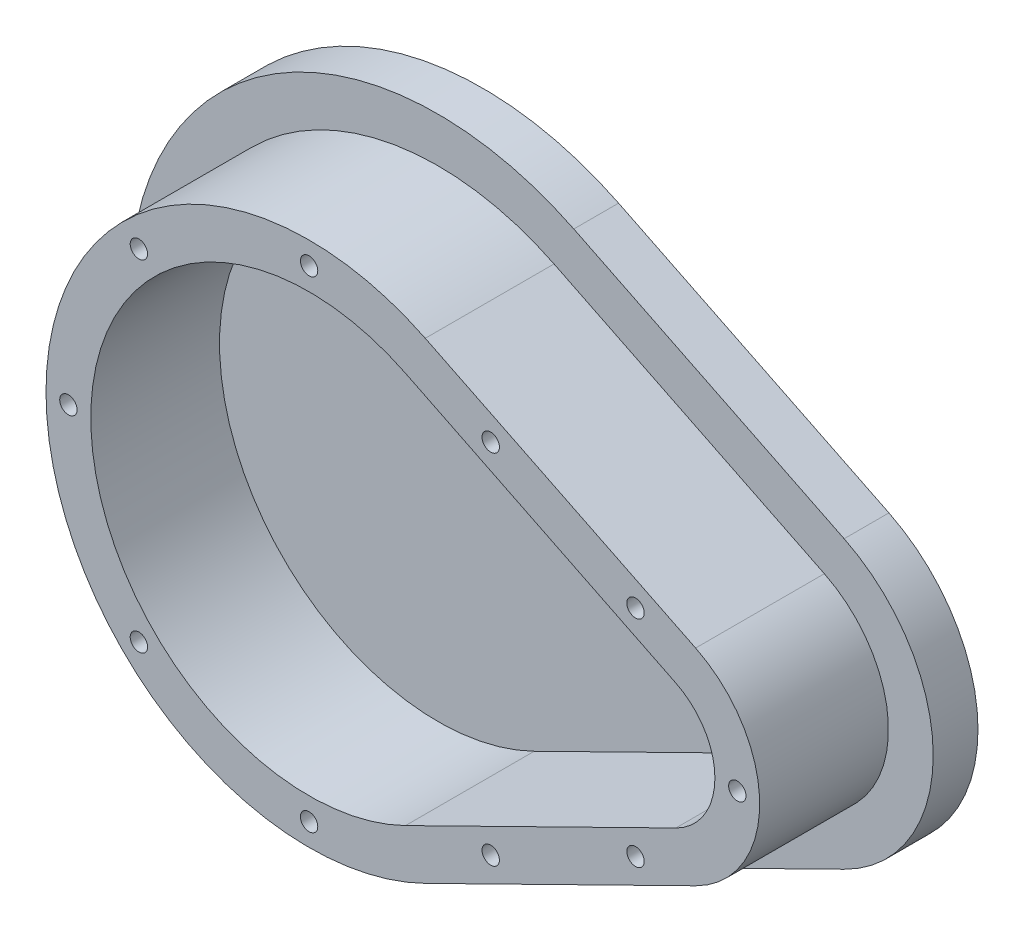
ISO-10303-21;
HEADER;
FILE_DESCRIPTION(('STEP AP214'),'2;1');
FILE_NAME('part.step','',(''),(''),'','','');
FILE_SCHEMA(('AUTOMOTIVE_DESIGN { 1 0 10303 214 1 1 1 1 }'));
ENDSEC;
DATA;
#1=APPLICATION_CONTEXT('core data for automotive mechanical design processes');
#2=APPLICATION_PROTOCOL_DEFINITION('international standard','automotive_design',2000,#1);
#3=PRODUCT_CONTEXT('',#1,'mechanical');
#4=PRODUCT('Part','Part','',(#3));
#5=PRODUCT_RELATED_PRODUCT_CATEGORY('part','',(#4));
#6=PRODUCT_DEFINITION_FORMATION('','',#4);
#7=PRODUCT_DEFINITION_CONTEXT('part definition',#1,'design');
#8=PRODUCT_DEFINITION('design','',#6,#7);
#9=PRODUCT_DEFINITION_SHAPE('','',#8);
#10=(LENGTH_UNIT() NAMED_UNIT(*) SI_UNIT(.MILLI.,.METRE.));
#11=(NAMED_UNIT(*) PLANE_ANGLE_UNIT() SI_UNIT($,.RADIAN.));
#12=(NAMED_UNIT(*) SI_UNIT($,.STERADIAN.) SOLID_ANGLE_UNIT());
#13=UNCERTAINTY_MEASURE_WITH_UNIT(LENGTH_MEASURE(1.E-05),#10,'distance_accuracy_value','');
#14=(GEOMETRIC_REPRESENTATION_CONTEXT(3) GLOBAL_UNCERTAINTY_ASSIGNED_CONTEXT((#13)) GLOBAL_UNIT_ASSIGNED_CONTEXT((#10,
#11,#12)) REPRESENTATION_CONTEXT('',''));
#15=CARTESIAN_POINT('',(0.,0.,0.));
#16=DIRECTION('',(0.,0.,1.));
#17=DIRECTION('',(1.,0.,0.));
#18=AXIS2_PLACEMENT_3D('',#15,#16,#17);
#19=CARTESIAN_POINT('',(60.,0.,8.));
#20=DIRECTION('',(0.,0.,-1.));
#21=DIRECTION('',(-1.,0.,0.));
#22=AXIS2_PLACEMENT_3D('',#19,#20,#21);
#23=PLANE('',#22);
#24=CARTESIAN_POINT('',(60.,0.,8.));
#25=DIRECTION('',(0.,0.,1.));
#26=DIRECTION('',(-1.,0.,0.));
#27=AXIS2_PLACEMENT_3D('',#24,#25,#26);
#28=CIRCLE('',#27,28.5);
#29=CARTESIAN_POINT('',(72.5875,-25.5696078137698,8.));
#30=VERTEX_POINT('',#29);
#31=CARTESIAN_POINT('',(72.5875,25.5696078137698,8.));
#32=VERTEX_POINT('',#31);
#33=EDGE_CURVE('E224',#30,#32,#28,.T.);
#34=ORIENTED_EDGE('',*,*,#33,.T.);
#35=DIRECTION('',(-0.897179221535784,0.441666666666667,0.));
#36=VECTOR('',#35,1.);
#37=CARTESIAN_POINT('',(72.5875,25.5696078137698,8.));
#38=LINE('',#37,#36);
#39=CARTESIAN_POINT('',(24.2916666666667,49.3448571844681,8.));
#40=VERTEX_POINT('',#39);
#41=EDGE_CURVE('E228',#32,#40,#38,.T.);
#42=ORIENTED_EDGE('',*,*,#41,.T.);
#43=CARTESIAN_POINT('',(0.,0.,8.));
#44=DIRECTION('',(0.,0.,1.));
#45=DIRECTION('',(1.,0.,0.));
#46=AXIS2_PLACEMENT_3D('',#43,#44,#45);
#47=CIRCLE('',#46,55.);
#48=CARTESIAN_POINT('',(24.2916666666667,-49.3448571844681,8.));
#49=VERTEX_POINT('',#48);
#50=EDGE_CURVE('E232',#40,#49,#47,.T.);
#51=ORIENTED_EDGE('',*,*,#50,.T.);
#52=DIRECTION('',(0.897179221535784,0.441666666666667,0.));
#53=VECTOR('',#52,1.);
#54=CARTESIAN_POINT('',(72.5875,-25.5696078137698,8.));
#55=LINE('',#54,#53);
#56=EDGE_CURVE('E235',#49,#30,#55,.T.);
#57=ORIENTED_EDGE('',*,*,#56,.T.);
#58=EDGE_LOOP('',(#34,#42,#51,#57));
#59=FACE_BOUND('',#58,.T.);
#60=CARTESIAN_POINT('',(0.,0.,8.));
#61=DIRECTION('',(0.,0.,1.));
#62=DIRECTION('',(1.,0.,0.));
#63=AXIS2_PLACEMENT_3D('',#60,#61,#62);
#64=CIRCLE('',#63,47.);
#65=CARTESIAN_POINT('',(20.7583333333334,42.1674234121819,8.));
#66=VERTEX_POINT('',#65);
#67=CARTESIAN_POINT('',(20.7583333333333,-42.1674234121819,8.));
#68=VERTEX_POINT('',#67);
#69=EDGE_CURVE('E148',#66,#68,#64,.T.);
#70=ORIENTED_EDGE('',*,*,#69,.F.);
#71=DIRECTION('',(-0.897179221535784,0.441666666666667,0.));
#72=VECTOR('',#71,1.);
#73=CARTESIAN_POINT('',(20.7583333333334,42.1674234121819,8.));
#74=LINE('',#73,#72);
#75=CARTESIAN_POINT('',(69.0541666666667,18.3921740414836,8.));
#76=VERTEX_POINT('',#75);
#77=EDGE_CURVE('E189',#76,#66,#74,.T.);
#78=ORIENTED_EDGE('',*,*,#77,.F.);
#79=CARTESIAN_POINT('',(60.,0.,8.));
#80=DIRECTION('',(0.,0.,1.));
#81=DIRECTION('',(-1.,0.,0.));
#82=AXIS2_PLACEMENT_3D('',#79,#80,#81);
#83=CIRCLE('',#82,20.5);
#84=CARTESIAN_POINT('',(69.0541666666667,-18.3921740414836,8.));
#85=VERTEX_POINT('',#84);
#86=EDGE_CURVE('E60',#85,#76,#83,.T.);
#87=ORIENTED_EDGE('',*,*,#86,.F.);
#88=DIRECTION('',(0.897179221535784,0.441666666666667,0.));
#89=VECTOR('',#88,1.);
#90=CARTESIAN_POINT('',(69.0541666666667,-18.3921740414836,8.));
#91=LINE('',#90,#89);
#92=EDGE_CURVE('E55',#68,#85,#91,.T.);
#93=ORIENTED_EDGE('',*,*,#92,.F.);
#94=EDGE_LOOP('',(#70,#78,#87,#93));
#95=FACE_BOUND('',#94,.T.);
#96=ADVANCED_FACE('F39',(#59,#95),#23,.F.);
#97=CARTESIAN_POINT('',(60.,0.,8.));
#98=DIRECTION('',(0.,0.,-1.));
#99=DIRECTION('',(-1.,0.,0.));
#100=AXIS2_PLACEMENT_3D('',#97,#98,#99);
#101=CYLINDRICAL_SURFACE('',#100,28.5);
#102=CARTESIAN_POINT('',(60.,0.,0.));
#103=DIRECTION('',(0.,0.,1.));
#104=DIRECTION('',(-1.,0.,0.));
#105=AXIS2_PLACEMENT_3D('',#102,#103,#104);
#106=CIRCLE('',#105,28.5);
#107=CARTESIAN_POINT('',(72.5875,-25.5696078137698,0.));
#108=VERTEX_POINT('',#107);
#109=CARTESIAN_POINT('',(72.5875,25.5696078137698,0.));
#110=VERTEX_POINT('',#109);
#111=EDGE_CURVE('E223',#108,#110,#106,.T.);
#112=ORIENTED_EDGE('',*,*,#111,.T.);
#113=DIRECTION('',(0.,0.,-1.));
#114=VECTOR('',#113,1.);
#115=CARTESIAN_POINT('',(72.5875,25.5696078137698,8.));
#116=LINE('',#115,#114);
#117=EDGE_CURVE('E11',#32,#110,#116,.T.);
#118=ORIENTED_EDGE('',*,*,#117,.F.);
#119=ORIENTED_EDGE('',*,*,#33,.F.);
#120=DIRECTION('',(0.,0.,-1.));
#121=VECTOR('',#120,1.);
#122=CARTESIAN_POINT('',(72.5875,-25.5696078137698,8.));
#123=LINE('',#122,#121);
#124=EDGE_CURVE('E238',#30,#108,#123,.T.);
#125=ORIENTED_EDGE('',*,*,#124,.T.);
#126=EDGE_LOOP('',(#112,#118,#119,#125));
#127=FACE_BOUND('',#126,.T.);
#128=ADVANCED_FACE('F41',(#127),#101,.T.);
#129=CARTESIAN_POINT('',(72.5875,25.5696078137698,8.));
#130=DIRECTION('',(-0.441666666666667,-0.897179221535784,0.));
#131=DIRECTION('',(0.897179221535784,-0.441666666666667,0.));
#132=AXIS2_PLACEMENT_3D('',#129,#130,#131);
#133=PLANE('',#132);
#134=DIRECTION('',(-0.897179221535784,0.441666666666667,0.));
#135=VECTOR('',#134,1.);
#136=CARTESIAN_POINT('',(72.5875,25.5696078137698,0.));
#137=LINE('',#136,#135);
#138=CARTESIAN_POINT('',(24.2916666666667,49.3448571844681,0.));
#139=VERTEX_POINT('',#138);
#140=EDGE_CURVE('E242',#110,#139,#137,.T.);
#141=ORIENTED_EDGE('',*,*,#140,.T.);
#142=DIRECTION('',(0.,0.,-1.));
#143=VECTOR('',#142,1.);
#144=CARTESIAN_POINT('',(24.2916666666667,49.3448571844681,8.));
#145=LINE('',#144,#143);
#146=EDGE_CURVE('E48',#40,#139,#145,.T.);
#147=ORIENTED_EDGE('',*,*,#146,.F.);
#148=ORIENTED_EDGE('',*,*,#41,.F.);
#149=ORIENTED_EDGE('',*,*,#117,.T.);
#150=EDGE_LOOP('',(#141,#147,#148,#149));
#151=FACE_BOUND('',#150,.T.);
#152=ADVANCED_FACE('F277',(#151),#133,.F.);
#153=CARTESIAN_POINT('',(0.,0.,8.));
#154=DIRECTION('',(0.,0.,-1.));
#155=DIRECTION('',(-1.,0.,0.));
#156=AXIS2_PLACEMENT_3D('',#153,#154,#155);
#157=CYLINDRICAL_SURFACE('',#156,55.);
#158=CARTESIAN_POINT('',(0.,0.,0.));
#159=DIRECTION('',(0.,0.,1.));
#160=DIRECTION('',(1.,0.,0.));
#161=AXIS2_PLACEMENT_3D('',#158,#159,#160);
#162=CIRCLE('',#161,55.);
#163=CARTESIAN_POINT('',(24.2916666666667,-49.3448571844681,0.));
#164=VERTEX_POINT('',#163);
#165=EDGE_CURVE('E245',#139,#164,#162,.T.);
#166=ORIENTED_EDGE('',*,*,#165,.T.);
#167=DIRECTION('',(0.,0.,-1.));
#168=VECTOR('',#167,1.);
#169=CARTESIAN_POINT('',(24.2916666666667,-49.3448571844681,8.));
#170=LINE('',#169,#168);
#171=EDGE_CURVE('E253',#49,#164,#170,.T.);
#172=ORIENTED_EDGE('',*,*,#171,.F.);
#173=ORIENTED_EDGE('',*,*,#50,.F.);
#174=ORIENTED_EDGE('',*,*,#146,.T.);
#175=EDGE_LOOP('',(#166,#172,#173,#174));
#176=FACE_BOUND('',#175,.T.);
#177=ADVANCED_FACE('F262',(#176),#157,.T.);
#178=CARTESIAN_POINT('',(72.5875,-25.5696078137698,8.));
#179=DIRECTION('',(-0.441666666666667,0.897179221535784,0.));
#180=DIRECTION('',(-0.897179221535784,-0.441666666666667,0.));
#181=AXIS2_PLACEMENT_3D('',#178,#179,#180);
#182=PLANE('',#181);
#183=DIRECTION('',(0.897179221535784,0.441666666666667,0.));
#184=VECTOR('',#183,1.);
#185=CARTESIAN_POINT('',(72.5875,-25.5696078137698,0.));
#186=LINE('',#185,#184);
#187=EDGE_CURVE('E229',#164,#108,#186,.T.);
#188=ORIENTED_EDGE('',*,*,#187,.T.);
#189=ORIENTED_EDGE('',*,*,#124,.F.);
#190=ORIENTED_EDGE('',*,*,#56,.F.);
#191=ORIENTED_EDGE('',*,*,#171,.T.);
#192=EDGE_LOOP('',(#188,#189,#190,#191));
#193=FACE_BOUND('',#192,.T.);
#194=ADVANCED_FACE('F271',(#193),#182,.F.);
#195=CARTESIAN_POINT('',(60.,0.,0.));
#196=DIRECTION('',(0.,0.,-1.));
#197=DIRECTION('',(-1.,0.,0.));
#198=AXIS2_PLACEMENT_3D('',#195,#196,#197);
#199=PLANE('',#198);
#200=CARTESIAN_POINT('',(0.,43.,0.));
#201=DIRECTION('',(0.,0.,-1.));
#202=DIRECTION('',(-1.,0.,0.));
#203=AXIS2_PLACEMENT_3D('',#200,#201,#202);
#204=CIRCLE('',#203,1.55);
#205=CARTESIAN_POINT('',(-1.55,43.,0.));
#206=VERTEX_POINT('',#205);
#207=EDGE_CURVE('E167',#206,#206,#204,.F.);
#208=ORIENTED_EDGE('',*,*,#207,.T.);
#209=EDGE_LOOP('',(#208));
#210=FACE_BOUND('',#209,.T.);
#211=CARTESIAN_POINT('',(32.4493549897034,-31.9537065260387,0.));
#212=DIRECTION('',(0.,0.,-1.));
#213=DIRECTION('',(-1.,0.,0.));
#214=AXIS2_PLACEMENT_3D('',#211,#212,#213);
#215=CIRCLE('',#214,1.55);
#216=CARTESIAN_POINT('',(30.8993549897034,-31.9537065260387,0.));
#217=VERTEX_POINT('',#216);
#218=EDGE_CURVE('E510',#217,#217,#215,.F.);
#219=ORIENTED_EDGE('',*,*,#218,.T.);
#220=EDGE_LOOP('',(#219));
#221=FACE_BOUND('',#220,.T.);
#222=CARTESIAN_POINT('',(-30.4055915910181,-30.405591591022,0.));
#223=DIRECTION('',(0.,0.,-1.));
#224=DIRECTION('',(-1.,0.,0.));
#225=AXIS2_PLACEMENT_3D('',#222,#223,#224);
#226=CIRCLE('',#225,1.55000000000305);
#227=CARTESIAN_POINT('',(-31.9555915910211,-30.405591591022,0.));
#228=VERTEX_POINT('',#227);
#229=EDGE_CURVE('E552',#228,#228,#226,.F.);
#230=ORIENTED_EDGE('',*,*,#229,.T.);
#231=EDGE_LOOP('',(#230));
#232=FACE_BOUND('',#231,.T.);
#233=CARTESIAN_POINT('',(-42.999999999997,-1.42165573929378E-12,0.));
#234=DIRECTION('',(0.,0.,-1.));
#235=DIRECTION('',(-1.,0.,0.));
#236=AXIS2_PLACEMENT_3D('',#233,#234,#235);
#237=CIRCLE('',#236,1.55000000000211);
#238=CARTESIAN_POINT('',(-44.5499999999991,-1.42165573929378E-12,0.));
#239=VERTEX_POINT('',#238);
#240=EDGE_CURVE('E551',#239,#239,#237,.F.);
#241=ORIENTED_EDGE('',*,*,#240,.T.);
#242=EDGE_LOOP('',(#241));
#243=FACE_BOUND('',#242,.T.);
#244=CARTESIAN_POINT('',(-30.4055915910201,30.40559159102,0.));
#245=DIRECTION('',(0.,0.,-1.));
#246=DIRECTION('',(-1.,0.,0.));
#247=AXIS2_PLACEMENT_3D('',#244,#245,#246);
#248=CIRCLE('',#247,1.55000000000064);
#249=CARTESIAN_POINT('',(-31.9555915910207,30.40559159102,0.));
#250=VERTEX_POINT('',#249);
#251=EDGE_CURVE('E567',#250,#250,#248,.F.);
#252=ORIENTED_EDGE('',*,*,#251,.T.);
#253=EDGE_LOOP('',(#252));
#254=FACE_BOUND('',#253,.T.);
#255=CARTESIAN_POINT('',(76.5,0.,0.));
#256=DIRECTION('',(0.,0.,-1.));
#257=DIRECTION('',(-1.,0.,0.));
#258=AXIS2_PLACEMENT_3D('',#255,#256,#257);
#259=CIRCLE('',#258,1.54999999999999);
#260=CARTESIAN_POINT('',(74.95,0.,0.));
#261=VERTEX_POINT('',#260);
#262=EDGE_CURVE('E503',#261,#261,#259,.F.);
#263=ORIENTED_EDGE('',*,*,#262,.T.);
#264=EDGE_LOOP('',(#263));
#265=FACE_BOUND('',#264,.T.);
#266=CARTESIAN_POINT('',(58.3157077846422,-19.2201238220071,0.));
#267=DIRECTION('',(0.,0.,-1.));
#268=DIRECTION('',(-1.,0.,0.));
#269=AXIS2_PLACEMENT_3D('',#266,#267,#268);
#270=CIRCLE('',#269,1.55);
#271=CARTESIAN_POINT('',(56.7657077846422,-19.2201238220071,0.));
#272=VERTEX_POINT('',#271);
#273=EDGE_CURVE('E520',#272,#272,#270,.F.);
#274=ORIENTED_EDGE('',*,*,#273,.T.);
#275=EDGE_LOOP('',(#274));
#276=FACE_BOUND('',#275,.T.);
#277=CARTESIAN_POINT('',(32.4493549897034,31.9537065260387,0.));
#278=DIRECTION('',(0.,0.,-1.));
#279=DIRECTION('',(-1.,0.,0.));
#280=AXIS2_PLACEMENT_3D('',#277,#278,#279);
#281=CIRCLE('',#280,1.55);
#282=CARTESIAN_POINT('',(30.8993549897034,31.9537065260387,0.));
#283=VERTEX_POINT('',#282);
#284=EDGE_CURVE('E519',#283,#283,#281,.F.);
#285=ORIENTED_EDGE('',*,*,#284,.T.);
#286=EDGE_LOOP('',(#285));
#287=FACE_BOUND('',#286,.T.);
#288=CARTESIAN_POINT('',(58.3157077846422,19.2201238220071,0.));
#289=DIRECTION('',(0.,0.,-1.));
#290=DIRECTION('',(-1.,0.,0.));
#291=AXIS2_PLACEMENT_3D('',#288,#289,#290);
#292=CIRCLE('',#291,1.55);
#293=CARTESIAN_POINT('',(56.7657077846421,19.2201238220071,0.));
#294=VERTEX_POINT('',#293);
#295=EDGE_CURVE('E536',#294,#294,#292,.F.);
#296=ORIENTED_EDGE('',*,*,#295,.T.);
#297=EDGE_LOOP('',(#296));
#298=FACE_BOUND('',#297,.T.);
#299=CARTESIAN_POINT('',(2.84331147858757E-12,-43.,0.));
#300=DIRECTION('',(0.,0.,-1.));
#301=DIRECTION('',(-1.,0.,0.));
#302=AXIS2_PLACEMENT_3D('',#299,#300,#301);
#303=CIRCLE('',#302,1.55000000000243);
#304=CARTESIAN_POINT('',(-1.54999999999959,-43.,0.));
#305=VERTEX_POINT('',#304);
#306=EDGE_CURVE('E535',#305,#305,#303,.F.);
#307=ORIENTED_EDGE('',*,*,#306,.T.);
#308=EDGE_LOOP('',(#307));
#309=FACE_BOUND('',#308,.T.);
#310=ORIENTED_EDGE('',*,*,#111,.F.);
#311=ORIENTED_EDGE('',*,*,#187,.F.);
#312=ORIENTED_EDGE('',*,*,#165,.F.);
#313=ORIENTED_EDGE('',*,*,#140,.F.);
#314=EDGE_LOOP('',(#310,#311,#312,#313));
#315=FACE_BOUND('',#314,.T.);
#316=ADVANCED_FACE('F268',(#210,#221,#232,#243,#254,#265,#276,#287,#298,#309,#315),#199,.T.);
#317=CARTESIAN_POINT('',(0.,0.,31.));
#318=DIRECTION('',(0.,0.,1.));
#319=DIRECTION('',(1.,0.,0.));
#320=AXIS2_PLACEMENT_3D('',#317,#318,#319);
#321=PLANE('',#320);
#322=CARTESIAN_POINT('',(0.,43.,31.));
#323=DIRECTION('',(0.,0.,1.));
#324=DIRECTION('',(1.,0.,0.));
#325=AXIS2_PLACEMENT_3D('',#322,#323,#324);
#326=CIRCLE('',#325,1.55);
#327=CARTESIAN_POINT('',(1.55,43.,31.));
#328=VERTEX_POINT('',#327);
#329=EDGE_CURVE('E497',#328,#328,#326,.T.);
#330=ORIENTED_EDGE('',*,*,#329,.F.);
#331=EDGE_LOOP('',(#330));
#332=FACE_BOUND('',#331,.T.);
#333=CARTESIAN_POINT('',(32.4493549897034,-31.9537065260387,31.));
#334=DIRECTION('',(0.,0.,1.));
#335=DIRECTION('',(1.,0.,0.));
#336=AXIS2_PLACEMENT_3D('',#333,#334,#335);
#337=CIRCLE('',#336,1.55);
#338=CARTESIAN_POINT('',(33.9993549897034,-31.9537065260387,31.));
#339=VERTEX_POINT('',#338);
#340=EDGE_CURVE('E506',#339,#339,#337,.T.);
#341=ORIENTED_EDGE('',*,*,#340,.F.);
#342=EDGE_LOOP('',(#341));
#343=FACE_BOUND('',#342,.T.);
#344=CARTESIAN_POINT('',(-30.4055915910181,-30.405591591022,31.));
#345=DIRECTION('',(0.,0.,1.));
#346=DIRECTION('',(1.,0.,0.));
#347=AXIS2_PLACEMENT_3D('',#344,#345,#346);
#348=CIRCLE('',#347,1.55000000000305);
#349=CARTESIAN_POINT('',(-28.855591591015,-30.405591591022,31.));
#350=VERTEX_POINT('',#349);
#351=EDGE_CURVE('E540',#350,#350,#348,.T.);
#352=ORIENTED_EDGE('',*,*,#351,.F.);
#353=EDGE_LOOP('',(#352));
#354=FACE_BOUND('',#353,.T.);
#355=CARTESIAN_POINT('',(-42.999999999997,-1.42165573929378E-12,31.));
#356=DIRECTION('',(0.,0.,1.));
#357=DIRECTION('',(1.,0.,0.));
#358=AXIS2_PLACEMENT_3D('',#355,#356,#357);
#359=CIRCLE('',#358,1.55000000000211);
#360=CARTESIAN_POINT('',(-41.4499999999948,-1.42165573929378E-12,31.));
#361=VERTEX_POINT('',#360);
#362=EDGE_CURVE('E547',#361,#361,#359,.T.);
#363=ORIENTED_EDGE('',*,*,#362,.F.);
#364=EDGE_LOOP('',(#363));
#365=FACE_BOUND('',#364,.T.);
#366=CARTESIAN_POINT('',(-30.4055915910201,30.40559159102,31.));
#367=DIRECTION('',(0.,0.,1.));
#368=DIRECTION('',(1.,0.,0.));
#369=AXIS2_PLACEMENT_3D('',#366,#367,#368);
#370=CIRCLE('',#369,1.55000000000064);
#371=CARTESIAN_POINT('',(-28.8555915910194,30.40559159102,31.));
#372=VERTEX_POINT('',#371);
#373=EDGE_CURVE('E556',#372,#372,#370,.T.);
#374=ORIENTED_EDGE('',*,*,#373,.F.);
#375=EDGE_LOOP('',(#374));
#376=FACE_BOUND('',#375,.T.);
#377=CARTESIAN_POINT('',(76.5,0.,31.));
#378=DIRECTION('',(0.,0.,1.));
#379=DIRECTION('',(1.,0.,0.));
#380=AXIS2_PLACEMENT_3D('',#377,#378,#379);
#381=CIRCLE('',#380,1.54999999999999);
#382=CARTESIAN_POINT('',(78.05,0.,31.));
#383=VERTEX_POINT('',#382);
#384=EDGE_CURVE('E563',#383,#383,#381,.T.);
#385=ORIENTED_EDGE('',*,*,#384,.F.);
#386=EDGE_LOOP('',(#385));
#387=FACE_BOUND('',#386,.T.);
#388=CARTESIAN_POINT('',(58.3157077846422,-19.2201238220071,31.));
#389=DIRECTION('',(0.,0.,1.));
#390=DIRECTION('',(1.,0.,0.));
#391=AXIS2_PLACEMENT_3D('',#388,#389,#390);
#392=CIRCLE('',#391,1.55);
#393=CARTESIAN_POINT('',(59.8657077846422,-19.2201238220071,31.));
#394=VERTEX_POINT('',#393);
#395=EDGE_CURVE('E514',#394,#394,#392,.T.);
#396=ORIENTED_EDGE('',*,*,#395,.F.);
#397=EDGE_LOOP('',(#396));
#398=FACE_BOUND('',#397,.T.);
#399=CARTESIAN_POINT('',(32.4493549897034,31.9537065260387,31.));
#400=DIRECTION('',(0.,0.,1.));
#401=DIRECTION('',(1.,0.,0.));
#402=AXIS2_PLACEMENT_3D('',#399,#400,#401);
#403=CIRCLE('',#402,1.55);
#404=CARTESIAN_POINT('',(33.9993549897034,31.9537065260387,31.));
#405=VERTEX_POINT('',#404);
#406=EDGE_CURVE('E515',#405,#405,#403,.T.);
#407=ORIENTED_EDGE('',*,*,#406,.F.);
#408=EDGE_LOOP('',(#407));
#409=FACE_BOUND('',#408,.T.);
#410=CARTESIAN_POINT('',(58.3157077846422,19.2201238220071,31.));
#411=DIRECTION('',(0.,0.,1.));
#412=DIRECTION('',(1.,0.,0.));
#413=AXIS2_PLACEMENT_3D('',#410,#411,#412);
#414=CIRCLE('',#413,1.55);
#415=CARTESIAN_POINT('',(59.8657077846422,19.2201238220071,31.));
#416=VERTEX_POINT('',#415);
#417=EDGE_CURVE('E524',#416,#416,#414,.T.);
#418=ORIENTED_EDGE('',*,*,#417,.F.);
#419=EDGE_LOOP('',(#418));
#420=FACE_BOUND('',#419,.T.);
#421=CARTESIAN_POINT('',(2.84331147858757E-12,-43.,31.));
#422=DIRECTION('',(0.,0.,1.));
#423=DIRECTION('',(1.,0.,0.));
#424=AXIS2_PLACEMENT_3D('',#421,#422,#423);
#425=CIRCLE('',#424,1.55000000000243);
#426=CARTESIAN_POINT('',(1.55000000000527,-43.,31.));
#427=VERTEX_POINT('',#426);
#428=EDGE_CURVE('E531',#427,#427,#425,.T.);
#429=ORIENTED_EDGE('',*,*,#428,.F.);
#430=EDGE_LOOP('',(#429));
#431=FACE_BOUND('',#430,.T.);
#432=CARTESIAN_POINT('',(0.,0.,31.));
#433=DIRECTION('',(0.,0.,1.));
#434=DIRECTION('',(1.,0.,0.));
#435=AXIS2_PLACEMENT_3D('',#432,#433,#434);
#436=CIRCLE('',#435,47.);
#437=CARTESIAN_POINT('',(20.7583333333334,42.1674234121819,31.));
#438=VERTEX_POINT('',#437);
#439=CARTESIAN_POINT('',(20.7583333333333,-42.1674234121819,31.));
#440=VERTEX_POINT('',#439);
#441=EDGE_CURVE('E184',#438,#440,#436,.T.);
#442=ORIENTED_EDGE('',*,*,#441,.T.);
#443=DIRECTION('',(0.897179221535784,0.441666666666667,0.));
#444=VECTOR('',#443,1.);
#445=CARTESIAN_POINT('',(69.0541666666667,-18.3921740414836,31.));
#446=LINE('',#445,#444);
#447=CARTESIAN_POINT('',(69.0541666666667,-18.3921740414836,31.));
#448=VERTEX_POINT('',#447);
#449=EDGE_CURVE('E188',#440,#448,#446,.T.);
#450=ORIENTED_EDGE('',*,*,#449,.T.);
#451=CARTESIAN_POINT('',(60.,0.,31.));
#452=DIRECTION('',(0.,0.,1.));
#453=DIRECTION('',(-1.,0.,0.));
#454=AXIS2_PLACEMENT_3D('',#451,#452,#453);
#455=CIRCLE('',#454,20.5);
#456=CARTESIAN_POINT('',(69.0541666666667,18.3921740414836,31.));
#457=VERTEX_POINT('',#456);
#458=EDGE_CURVE('E192',#448,#457,#455,.T.);
#459=ORIENTED_EDGE('',*,*,#458,.T.);
#460=DIRECTION('',(-0.897179221535784,0.441666666666667,0.));
#461=VECTOR('',#460,1.);
#462=CARTESIAN_POINT('',(20.7583333333334,42.1674234121819,31.));
#463=LINE('',#462,#461);
#464=EDGE_CURVE('E195',#457,#438,#463,.T.);
#465=ORIENTED_EDGE('',*,*,#464,.T.);
#466=EDGE_LOOP('',(#442,#450,#459,#465));
#467=FACE_BOUND('',#466,.T.);
#468=DIRECTION('',(-0.897179221535784,0.441666666666667,0.));
#469=VECTOR('',#468,1.);
#470=CARTESIAN_POINT('',(65.5208333333333,11.2147402691973,31.));
#471=LINE('',#470,#469);
#472=CARTESIAN_POINT('',(65.5208333333333,11.2147402691973,31.));
#473=VERTEX_POINT('',#472);
#474=CARTESIAN_POINT('',(17.225,34.9899896398956,31.));
#475=VERTEX_POINT('',#474);
#476=EDGE_CURVE('E139',#473,#475,#471,.T.);
#477=ORIENTED_EDGE('',*,*,#476,.F.);
#478=CARTESIAN_POINT('',(60.,0.,31.));
#479=DIRECTION('',(0.,0.,1.));
#480=DIRECTION('',(-1.,0.,0.));
#481=AXIS2_PLACEMENT_3D('',#478,#479,#480);
#482=CIRCLE('',#481,12.5);
#483=CARTESIAN_POINT('',(65.5208333333333,-11.2147402691973,31.));
#484=VERTEX_POINT('',#483);
#485=EDGE_CURVE('E128',#484,#473,#482,.T.);
#486=ORIENTED_EDGE('',*,*,#485,.F.);
#487=DIRECTION('',(0.897179221535784,0.441666666666667,0.));
#488=VECTOR('',#487,1.);
#489=CARTESIAN_POINT('',(65.5208333333333,-11.2147402691973,31.));
#490=LINE('',#489,#488);
#491=CARTESIAN_POINT('',(17.225,-34.9899896398956,31.));
#492=VERTEX_POINT('',#491);
#493=EDGE_CURVE('E158',#492,#484,#490,.T.);
#494=ORIENTED_EDGE('',*,*,#493,.F.);
#495=CARTESIAN_POINT('',(0.,0.,31.));
#496=DIRECTION('',(0.,0.,1.));
#497=DIRECTION('',(1.,0.,0.));
#498=AXIS2_PLACEMENT_3D('',#495,#496,#497);
#499=CIRCLE('',#498,39.);
#500=EDGE_CURVE('E154',#475,#492,#499,.T.);
#501=ORIENTED_EDGE('',*,*,#500,.F.);
#502=EDGE_LOOP('',(#477,#486,#494,#501));
#503=FACE_BOUND('',#502,.T.);
#504=ADVANCED_FACE('F152',(#332,#343,#354,#365,#376,#387,#398,#409,#420,#431,#467,#503),#321,.T.);
#505=CARTESIAN_POINT('',(0.,0.,31.));
#506=DIRECTION('',(0.,0.,-1.));
#507=DIRECTION('',(-1.,0.,0.));
#508=AXIS2_PLACEMENT_3D('',#505,#506,#507);
#509=CYLINDRICAL_SURFACE('',#508,47.);
#510=ORIENTED_EDGE('',*,*,#69,.T.);
#511=DIRECTION('',(0.,0.,-1.));
#512=VECTOR('',#511,1.);
#513=CARTESIAN_POINT('',(20.7583333333333,-42.1674234121819,31.));
#514=LINE('',#513,#512);
#515=EDGE_CURVE('E220',#440,#68,#514,.T.);
#516=ORIENTED_EDGE('',*,*,#515,.F.);
#517=ORIENTED_EDGE('',*,*,#441,.F.);
#518=DIRECTION('',(0.,0.,-1.));
#519=VECTOR('',#518,1.);
#520=CARTESIAN_POINT('',(20.7583333333334,42.1674234121819,31.));
#521=LINE('',#520,#519);
#522=EDGE_CURVE('E198',#438,#66,#521,.T.);
#523=ORIENTED_EDGE('',*,*,#522,.T.);
#524=EDGE_LOOP('',(#510,#516,#517,#523));
#525=FACE_BOUND('',#524,.T.);
#526=ADVANCED_FACE('F321',(#525),#509,.T.);
#527=CARTESIAN_POINT('',(69.0541666666667,-18.3921740414836,31.));
#528=DIRECTION('',(-0.441666666666667,0.897179221535784,0.));
#529=DIRECTION('',(-0.897179221535784,-0.441666666666667,0.));
#530=AXIS2_PLACEMENT_3D('',#527,#528,#529);
#531=PLANE('',#530);
#532=ORIENTED_EDGE('',*,*,#92,.T.);
#533=DIRECTION('',(0.,0.,-1.));
#534=VECTOR('',#533,1.);
#535=CARTESIAN_POINT('',(69.0541666666667,-18.3921740414836,31.));
#536=LINE('',#535,#534);
#537=EDGE_CURVE('E216',#448,#85,#536,.T.);
#538=ORIENTED_EDGE('',*,*,#537,.F.);
#539=ORIENTED_EDGE('',*,*,#449,.F.);
#540=ORIENTED_EDGE('',*,*,#515,.T.);
#541=EDGE_LOOP('',(#532,#538,#539,#540));
#542=FACE_BOUND('',#541,.T.);
#543=ADVANCED_FACE('F329',(#542),#531,.F.);
#544=CARTESIAN_POINT('',(60.,0.,31.));
#545=DIRECTION('',(0.,0.,-1.));
#546=DIRECTION('',(-1.,0.,0.));
#547=AXIS2_PLACEMENT_3D('',#544,#545,#546);
#548=CYLINDRICAL_SURFACE('',#547,20.5);
#549=ORIENTED_EDGE('',*,*,#86,.T.);
#550=DIRECTION('',(0.,0.,-1.));
#551=VECTOR('',#550,1.);
#552=CARTESIAN_POINT('',(69.0541666666667,18.3921740414836,31.));
#553=LINE('',#552,#551);
#554=EDGE_CURVE('E212',#457,#76,#553,.T.);
#555=ORIENTED_EDGE('',*,*,#554,.F.);
#556=ORIENTED_EDGE('',*,*,#458,.F.);
#557=ORIENTED_EDGE('',*,*,#537,.T.);
#558=EDGE_LOOP('',(#549,#555,#556,#557));
#559=FACE_BOUND('',#558,.T.);
#560=ADVANCED_FACE('F325',(#559),#548,.T.);
#561=CARTESIAN_POINT('',(20.7583333333334,42.1674234121819,31.));
#562=DIRECTION('',(-0.441666666666667,-0.897179221535784,0.));
#563=DIRECTION('',(0.897179221535784,-0.441666666666667,0.));
#564=AXIS2_PLACEMENT_3D('',#561,#562,#563);
#565=PLANE('',#564);
#566=ORIENTED_EDGE('',*,*,#77,.T.);
#567=ORIENTED_EDGE('',*,*,#522,.F.);
#568=ORIENTED_EDGE('',*,*,#464,.F.);
#569=ORIENTED_EDGE('',*,*,#554,.T.);
#570=EDGE_LOOP('',(#566,#567,#568,#569));
#571=FACE_BOUND('',#570,.T.);
#572=ADVANCED_FACE('F318',(#571),#565,.F.);
#573=CARTESIAN_POINT('',(60.,0.,31.));
#574=DIRECTION('',(0.,0.,-1.));
#575=DIRECTION('',(-1.,0.,0.));
#576=AXIS2_PLACEMENT_3D('',#573,#574,#575);
#577=CYLINDRICAL_SURFACE('',#576,12.5);
#578=CARTESIAN_POINT('',(60.,0.,8.));
#579=DIRECTION('',(0.,0.,1.));
#580=DIRECTION('',(-1.,0.,0.));
#581=AXIS2_PLACEMENT_3D('',#578,#579,#580);
#582=CIRCLE('',#581,12.5);
#583=CARTESIAN_POINT('',(65.5208333333333,-11.2147402691973,8.));
#584=VERTEX_POINT('',#583);
#585=CARTESIAN_POINT('',(65.5208333333333,11.2147402691973,8.));
#586=VERTEX_POINT('',#585);
#587=EDGE_CURVE('E164',#584,#586,#582,.T.);
#588=ORIENTED_EDGE('',*,*,#587,.F.);
#589=DIRECTION('',(0.,0.,-1.));
#590=VECTOR('',#589,1.);
#591=CARTESIAN_POINT('',(65.5208333333333,-11.2147402691973,31.));
#592=LINE('',#591,#590);
#593=EDGE_CURVE('E134',#484,#584,#592,.T.);
#594=ORIENTED_EDGE('',*,*,#593,.F.);
#595=ORIENTED_EDGE('',*,*,#485,.T.);
#596=DIRECTION('',(0.,0.,-1.));
#597=VECTOR('',#596,1.);
#598=CARTESIAN_POINT('',(65.5208333333333,11.2147402691973,31.));
#599=LINE('',#598,#597);
#600=EDGE_CURVE('E132',#473,#586,#599,.T.);
#601=ORIENTED_EDGE('',*,*,#600,.T.);
#602=EDGE_LOOP('',(#588,#594,#595,#601));
#603=FACE_BOUND('',#602,.T.);
#604=ADVANCED_FACE('F131',(#603),#577,.F.);
#605=CARTESIAN_POINT('',(65.5208333333333,11.2147402691973,31.));
#606=DIRECTION('',(-0.441666666666667,-0.897179221535784,0.));
#607=DIRECTION('',(0.897179221535784,-0.441666666666667,0.));
#608=AXIS2_PLACEMENT_3D('',#605,#606,#607);
#609=PLANE('',#608);
#610=DIRECTION('',(-0.897179221535784,0.441666666666667,0.));
#611=VECTOR('',#610,1.);
#612=CARTESIAN_POINT('',(65.5208333333333,11.2147402691973,8.));
#613=LINE('',#612,#611);
#614=CARTESIAN_POINT('',(17.225,34.9899896398956,8.));
#615=VERTEX_POINT('',#614);
#616=EDGE_CURVE('E146',#586,#615,#613,.T.);
#617=ORIENTED_EDGE('',*,*,#616,.F.);
#618=ORIENTED_EDGE('',*,*,#600,.F.);
#619=ORIENTED_EDGE('',*,*,#476,.T.);
#620=DIRECTION('',(0.,0.,-1.));
#621=VECTOR('',#620,1.);
#622=CARTESIAN_POINT('',(17.225,34.9899896398956,31.));
#623=LINE('',#622,#621);
#624=EDGE_CURVE('E149',#475,#615,#623,.T.);
#625=ORIENTED_EDGE('',*,*,#624,.T.);
#626=EDGE_LOOP('',(#617,#618,#619,#625));
#627=FACE_BOUND('',#626,.T.);
#628=ADVANCED_FACE('F143',(#627),#609,.T.);
#629=CARTESIAN_POINT('',(0.,0.,31.));
#630=DIRECTION('',(0.,0.,-1.));
#631=DIRECTION('',(-1.,0.,0.));
#632=AXIS2_PLACEMENT_3D('',#629,#630,#631);
#633=CYLINDRICAL_SURFACE('',#632,39.);
#634=CARTESIAN_POINT('',(0.,0.,8.));
#635=DIRECTION('',(0.,0.,1.));
#636=DIRECTION('',(1.,0.,0.));
#637=AXIS2_PLACEMENT_3D('',#634,#635,#636);
#638=CIRCLE('',#637,39.);
#639=CARTESIAN_POINT('',(17.225,-34.9899896398956,8.));
#640=VERTEX_POINT('',#639);
#641=EDGE_CURVE('E170',#615,#640,#638,.T.);
#642=ORIENTED_EDGE('',*,*,#641,.F.);
#643=ORIENTED_EDGE('',*,*,#624,.F.);
#644=ORIENTED_EDGE('',*,*,#500,.T.);
#645=DIRECTION('',(0.,0.,-1.));
#646=VECTOR('',#645,1.);
#647=CARTESIAN_POINT('',(17.225,-34.9899896398956,31.));
#648=LINE('',#647,#646);
#649=EDGE_CURVE('E179',#492,#640,#648,.T.);
#650=ORIENTED_EDGE('',*,*,#649,.T.);
#651=EDGE_LOOP('',(#642,#643,#644,#650));
#652=FACE_BOUND('',#651,.T.);
#653=ADVANCED_FACE('F302',(#652),#633,.F.);
#654=CARTESIAN_POINT('',(65.5208333333333,-11.2147402691973,31.));
#655=DIRECTION('',(-0.441666666666667,0.897179221535784,0.));
#656=DIRECTION('',(-0.897179221535784,-0.441666666666667,0.));
#657=AXIS2_PLACEMENT_3D('',#654,#655,#656);
#658=PLANE('',#657);
#659=DIRECTION('',(0.897179221535784,0.441666666666667,0.));
#660=VECTOR('',#659,1.);
#661=CARTESIAN_POINT('',(65.5208333333333,-11.2147402691973,8.));
#662=LINE('',#661,#660);
#663=EDGE_CURVE('E140',#640,#584,#662,.T.);
#664=ORIENTED_EDGE('',*,*,#663,.F.);
#665=ORIENTED_EDGE('',*,*,#649,.F.);
#666=ORIENTED_EDGE('',*,*,#493,.T.);
#667=ORIENTED_EDGE('',*,*,#593,.T.);
#668=EDGE_LOOP('',(#664,#665,#666,#667));
#669=FACE_BOUND('',#668,.T.);
#670=ADVANCED_FACE('F293',(#669),#658,.T.);
#671=ORIENTED_EDGE('',*,*,#663,.T.);
#672=ORIENTED_EDGE('',*,*,#587,.T.);
#673=ORIENTED_EDGE('',*,*,#616,.T.);
#674=ORIENTED_EDGE('',*,*,#641,.T.);
#675=EDGE_LOOP('',(#671,#672,#673,#674));
#676=FACE_BOUND('',#675,.T.);
#677=ADVANCED_FACE('F286',(#676),#23,.F.);
#678=CARTESIAN_POINT('',(2.84331147858757E-12,-43.,-4.38406204336522));
#679=DIRECTION('',(0.,0.,1.));
#680=DIRECTION('',(1.,0.,0.));
#681=AXIS2_PLACEMENT_3D('',#678,#679,#680);
#682=CYLINDRICAL_SURFACE('',#681,1.55000000000243);
#683=ORIENTED_EDGE('',*,*,#428,.T.);
#684=EDGE_LOOP('',(#683));
#685=FACE_BOUND('',#684,.T.);
#686=ORIENTED_EDGE('',*,*,#306,.F.);
#687=EDGE_LOOP('',(#686));
#688=FACE_BOUND('',#687,.T.);
#689=ADVANCED_FACE('F292',(#685,#688),#682,.F.);
#690=CARTESIAN_POINT('',(58.3157077846422,19.2201238220071,-4.38406204336522));
#691=DIRECTION('',(0.,0.,1.));
#692=DIRECTION('',(1.,0.,0.));
#693=AXIS2_PLACEMENT_3D('',#690,#691,#692);
#694=CYLINDRICAL_SURFACE('',#693,1.55);
#695=ORIENTED_EDGE('',*,*,#417,.T.);
#696=EDGE_LOOP('',(#695));
#697=FACE_BOUND('',#696,.T.);
#698=ORIENTED_EDGE('',*,*,#295,.F.);
#699=EDGE_LOOP('',(#698));
#700=FACE_BOUND('',#699,.T.);
#701=ADVANCED_FACE('F299',(#697,#700),#694,.F.);
#702=CARTESIAN_POINT('',(32.4493549897034,31.9537065260387,-4.38406204336522));
#703=DIRECTION('',(0.,0.,1.));
#704=DIRECTION('',(1.,0.,0.));
#705=AXIS2_PLACEMENT_3D('',#702,#703,#704);
#706=CYLINDRICAL_SURFACE('',#705,1.55);
#707=ORIENTED_EDGE('',*,*,#406,.T.);
#708=EDGE_LOOP('',(#707));
#709=FACE_BOUND('',#708,.T.);
#710=ORIENTED_EDGE('',*,*,#284,.F.);
#711=EDGE_LOOP('',(#710));
#712=FACE_BOUND('',#711,.T.);
#713=ADVANCED_FACE('F411',(#709,#712),#706,.F.);
#714=CARTESIAN_POINT('',(58.3157077846422,-19.2201238220071,-4.38406204336522));
#715=DIRECTION('',(0.,0.,1.));
#716=DIRECTION('',(1.,0.,0.));
#717=AXIS2_PLACEMENT_3D('',#714,#715,#716);
#718=CYLINDRICAL_SURFACE('',#717,1.55);
#719=ORIENTED_EDGE('',*,*,#395,.T.);
#720=EDGE_LOOP('',(#719));
#721=FACE_BOUND('',#720,.T.);
#722=ORIENTED_EDGE('',*,*,#273,.F.);
#723=EDGE_LOOP('',(#722));
#724=FACE_BOUND('',#723,.T.);
#725=ADVANCED_FACE('F421',(#721,#724),#718,.F.);
#726=CARTESIAN_POINT('',(76.5,0.,-4.38406204336522));
#727=DIRECTION('',(0.,0.,1.));
#728=DIRECTION('',(1.,0.,0.));
#729=AXIS2_PLACEMENT_3D('',#726,#727,#728);
#730=CYLINDRICAL_SURFACE('',#729,1.54999999999999);
#731=ORIENTED_EDGE('',*,*,#384,.T.);
#732=EDGE_LOOP('',(#731));
#733=FACE_BOUND('',#732,.T.);
#734=ORIENTED_EDGE('',*,*,#262,.F.);
#735=EDGE_LOOP('',(#734));
#736=FACE_BOUND('',#735,.T.);
#737=ADVANCED_FACE('F431',(#733,#736),#730,.F.);
#738=CARTESIAN_POINT('',(-30.4055915910201,30.40559159102,-4.38406204336522));
#739=DIRECTION('',(0.,0.,1.));
#740=DIRECTION('',(1.,0.,0.));
#741=AXIS2_PLACEMENT_3D('',#738,#739,#740);
#742=CYLINDRICAL_SURFACE('',#741,1.55000000000064);
#743=ORIENTED_EDGE('',*,*,#373,.T.);
#744=EDGE_LOOP('',(#743));
#745=FACE_BOUND('',#744,.T.);
#746=ORIENTED_EDGE('',*,*,#251,.F.);
#747=EDGE_LOOP('',(#746));
#748=FACE_BOUND('',#747,.T.);
#749=ADVANCED_FACE('F441',(#745,#748),#742,.F.);
#750=CARTESIAN_POINT('',(-42.999999999997,-1.42165573929378E-12,-4.38406204336522));
#751=DIRECTION('',(0.,0.,1.));
#752=DIRECTION('',(1.,0.,0.));
#753=AXIS2_PLACEMENT_3D('',#750,#751,#752);
#754=CYLINDRICAL_SURFACE('',#753,1.55000000000211);
#755=ORIENTED_EDGE('',*,*,#362,.T.);
#756=EDGE_LOOP('',(#755));
#757=FACE_BOUND('',#756,.T.);
#758=ORIENTED_EDGE('',*,*,#240,.F.);
#759=EDGE_LOOP('',(#758));
#760=FACE_BOUND('',#759,.T.);
#761=ADVANCED_FACE('F451',(#757,#760),#754,.F.);
#762=CARTESIAN_POINT('',(-30.4055915910181,-30.405591591022,-4.38406204336522));
#763=DIRECTION('',(0.,0.,1.));
#764=DIRECTION('',(1.,0.,0.));
#765=AXIS2_PLACEMENT_3D('',#762,#763,#764);
#766=CYLINDRICAL_SURFACE('',#765,1.55000000000305);
#767=ORIENTED_EDGE('',*,*,#351,.T.);
#768=EDGE_LOOP('',(#767));
#769=FACE_BOUND('',#768,.T.);
#770=ORIENTED_EDGE('',*,*,#229,.F.);
#771=EDGE_LOOP('',(#770));
#772=FACE_BOUND('',#771,.T.);
#773=ADVANCED_FACE('F460',(#769,#772),#766,.F.);
#774=CARTESIAN_POINT('',(32.4493549897034,-31.9537065260387,-4.38406204336522));
#775=DIRECTION('',(0.,0.,1.));
#776=DIRECTION('',(1.,0.,0.));
#777=AXIS2_PLACEMENT_3D('',#774,#775,#776);
#778=CYLINDRICAL_SURFACE('',#777,1.55);
#779=ORIENTED_EDGE('',*,*,#340,.T.);
#780=EDGE_LOOP('',(#779));
#781=FACE_BOUND('',#780,.T.);
#782=ORIENTED_EDGE('',*,*,#218,.F.);
#783=EDGE_LOOP('',(#782));
#784=FACE_BOUND('',#783,.T.);
#785=ADVANCED_FACE('F470',(#781,#784),#778,.F.);
#786=CARTESIAN_POINT('',(0.,43.,-4.38406204336522));
#787=DIRECTION('',(0.,0.,1.));
#788=DIRECTION('',(1.,0.,0.));
#789=AXIS2_PLACEMENT_3D('',#786,#787,#788);
#790=CYLINDRICAL_SURFACE('',#789,1.55);
#791=ORIENTED_EDGE('',*,*,#329,.T.);
#792=EDGE_LOOP('',(#791));
#793=FACE_BOUND('',#792,.T.);
#794=ORIENTED_EDGE('',*,*,#207,.F.);
#795=EDGE_LOOP('',(#794));
#796=FACE_BOUND('',#795,.T.);
#797=ADVANCED_FACE('F480',(#793,#796),#790,.F.);
#798=CLOSED_SHELL('',(#96,#128,#152,#177,#194,#316,#504,#526,#543,#560,#572,#604,#628,#653,#670,
#677,#689,#701,#713,#725,#737,#749,#761,#773,#785,#797));
#799=MANIFOLD_SOLID_BREP('B2',#798);
#800=ADVANCED_BREP_SHAPE_REPRESENTATION('',(#18,#799),#14);
#801=SHAPE_DEFINITION_REPRESENTATION(#9,#800);
ENDSEC;
END-ISO-10303-21;
